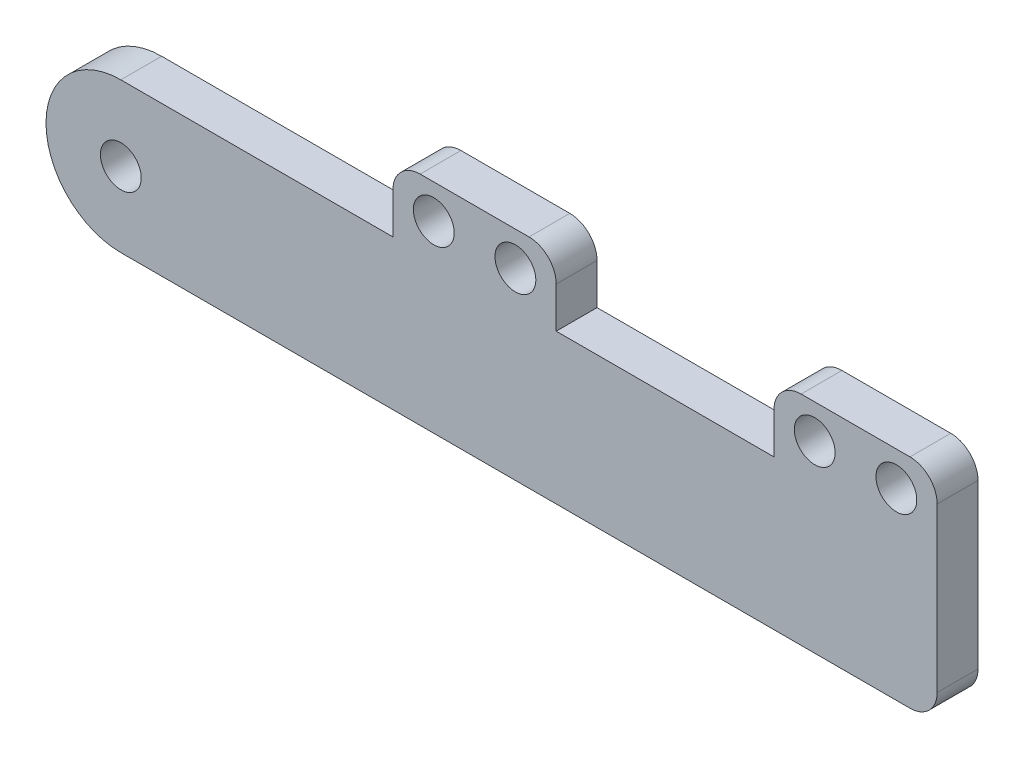
ISO-10303-21;
HEADER;
FILE_DESCRIPTION(('STEP AP214'),'2;1');
FILE_NAME('part.step','',(''),(''),'','','');
FILE_SCHEMA(('AUTOMOTIVE_DESIGN { 1 0 10303 214 1 1 1 1 }'));
ENDSEC;
DATA;
#1=APPLICATION_CONTEXT('core data for automotive mechanical design processes');
#2=APPLICATION_PROTOCOL_DEFINITION('international standard','automotive_design',2000,#1);
#3=PRODUCT_CONTEXT('',#1,'mechanical');
#4=PRODUCT('Part','Part','',(#3));
#5=PRODUCT_RELATED_PRODUCT_CATEGORY('part','',(#4));
#6=PRODUCT_DEFINITION_FORMATION('','',#4);
#7=PRODUCT_DEFINITION_CONTEXT('part definition',#1,'design');
#8=PRODUCT_DEFINITION('design','',#6,#7);
#9=PRODUCT_DEFINITION_SHAPE('','',#8);
#10=(LENGTH_UNIT() NAMED_UNIT(*) SI_UNIT(.MILLI.,.METRE.));
#11=(NAMED_UNIT(*) PLANE_ANGLE_UNIT() SI_UNIT($,.RADIAN.));
#12=(NAMED_UNIT(*) SI_UNIT($,.STERADIAN.) SOLID_ANGLE_UNIT());
#13=UNCERTAINTY_MEASURE_WITH_UNIT(LENGTH_MEASURE(1.E-05),#10,'distance_accuracy_value','');
#14=(GEOMETRIC_REPRESENTATION_CONTEXT(3) GLOBAL_UNCERTAINTY_ASSIGNED_CONTEXT((#13)) GLOBAL_UNIT_ASSIGNED_CONTEXT((#10,
#11,#12)) REPRESENTATION_CONTEXT('',''));
#15=CARTESIAN_POINT('',(0.,0.,0.));
#16=DIRECTION('',(0.,0.,1.));
#17=DIRECTION('',(1.,0.,0.));
#18=AXIS2_PLACEMENT_3D('',#15,#16,#17);
#19=CARTESIAN_POINT('',(-42.9563360227812,-5.5,3.));
#20=DIRECTION('',(0.,0.,-1.));
#21=DIRECTION('',(-1.,0.,0.));
#22=AXIS2_PLACEMENT_3D('',#19,#20,#21);
#23=PLANE('',#22);
#24=CARTESIAN_POINT('',(-42.9563360227812,-5.5,3.));
#25=DIRECTION('',(0.,0.,1.));
#26=DIRECTION('',(1.,0.,0.));
#27=AXIS2_PLACEMENT_3D('',#24,#25,#26);
#28=CIRCLE('',#27,1.5);
#29=CARTESIAN_POINT('',(-41.4563360227812,-5.5,3.));
#30=VERTEX_POINT('',#29);
#31=EDGE_CURVE('E304',#30,#30,#28,.T.);
#32=ORIENTED_EDGE('',*,*,#31,.F.);
#33=EDGE_LOOP('',(#32));
#34=FACE_BOUND('',#33,.T.);
#35=DIRECTION('',(1.,0.,0.));
#36=VECTOR('',#35,1.);
#37=CARTESIAN_POINT('',(17.0436639772188,-11.,3.));
#38=LINE('',#37,#36);
#39=CARTESIAN_POINT('',(-42.9563360227812,-11.,3.));
#40=VERTEX_POINT('',#39);
#41=CARTESIAN_POINT('',(15.0436639772188,-11.,3.));
#42=VERTEX_POINT('',#41);
#43=EDGE_CURVE('E152',#40,#42,#38,.T.);
#44=ORIENTED_EDGE('',*,*,#43,.T.);
#45=CARTESIAN_POINT('',(15.0436639772188,-9.,3.));
#46=DIRECTION('',(0.,0.,-1.));
#47=DIRECTION('',(-1.,0.,0.));
#48=AXIS2_PLACEMENT_3D('',#45,#46,#47);
#49=CIRCLE('',#48,2.);
#50=CARTESIAN_POINT('',(17.0436639772188,-8.99999999999999,3.));
#51=VERTEX_POINT('',#50);
#52=EDGE_CURVE('E195',#42,#51,#49,.F.);
#53=ORIENTED_EDGE('',*,*,#52,.T.);
#54=DIRECTION('',(0.,1.,0.));
#55=VECTOR('',#54,1.);
#56=CARTESIAN_POINT('',(17.0436639772188,5.,3.));
#57=LINE('',#56,#55);
#58=CARTESIAN_POINT('',(17.0436639772188,3.,3.));
#59=VERTEX_POINT('',#58);
#60=EDGE_CURVE('E276',#51,#59,#57,.T.);
#61=ORIENTED_EDGE('',*,*,#60,.T.);
#62=CARTESIAN_POINT('',(15.0436639772188,3.,3.));
#63=DIRECTION('',(0.,0.,-1.));
#64=DIRECTION('',(-1.,0.,0.));
#65=AXIS2_PLACEMENT_3D('',#62,#63,#64);
#66=CIRCLE('',#65,2.);
#67=CARTESIAN_POINT('',(15.0436639772188,5.,3.));
#68=VERTEX_POINT('',#67);
#69=EDGE_CURVE('E193',#59,#68,#66,.F.);
#70=ORIENTED_EDGE('',*,*,#69,.T.);
#71=DIRECTION('',(-1.,0.,0.));
#72=VECTOR('',#71,1.);
#73=CARTESIAN_POINT('',(5.04366397721881,5.,3.));
#74=LINE('',#73,#72);
#75=CARTESIAN_POINT('',(7.04366397721881,5.,3.));
#76=VERTEX_POINT('',#75);
#77=EDGE_CURVE('E273',#68,#76,#74,.T.);
#78=ORIENTED_EDGE('',*,*,#77,.T.);
#79=CARTESIAN_POINT('',(7.04366397721881,3.,3.));
#80=DIRECTION('',(0.,0.,-1.));
#81=DIRECTION('',(-1.,0.,0.));
#82=AXIS2_PLACEMENT_3D('',#79,#80,#81);
#83=CIRCLE('',#82,2.);
#84=CARTESIAN_POINT('',(5.04366397721881,3.,3.));
#85=VERTEX_POINT('',#84);
#86=EDGE_CURVE('E191',#76,#85,#83,.F.);
#87=ORIENTED_EDGE('',*,*,#86,.T.);
#88=DIRECTION('',(0.,-1.,0.));
#89=VECTOR('',#88,1.);
#90=CARTESIAN_POINT('',(5.04366397721881,0.,3.));
#91=LINE('',#90,#89);
#92=CARTESIAN_POINT('',(5.04366397721881,0.,3.));
#93=VERTEX_POINT('',#92);
#94=EDGE_CURVE('E271',#85,#93,#91,.T.);
#95=ORIENTED_EDGE('',*,*,#94,.T.);
#96=DIRECTION('',(-1.,0.,0.));
#97=VECTOR('',#96,1.);
#98=CARTESIAN_POINT('',(-10.9563360227812,0.,3.));
#99=LINE('',#98,#97);
#100=CARTESIAN_POINT('',(-10.9563360227812,0.,3.));
#101=VERTEX_POINT('',#100);
#102=EDGE_CURVE('E221',#93,#101,#99,.T.);
#103=ORIENTED_EDGE('',*,*,#102,.T.);
#104=DIRECTION('',(0.,1.,0.));
#105=VECTOR('',#104,1.);
#106=CARTESIAN_POINT('',(-10.9563360227812,5.,3.));
#107=LINE('',#106,#105);
#108=CARTESIAN_POINT('',(-10.9563360227812,3.,3.));
#109=VERTEX_POINT('',#108);
#110=EDGE_CURVE('E215',#101,#109,#107,.T.);
#111=ORIENTED_EDGE('',*,*,#110,.T.);
#112=CARTESIAN_POINT('',(-12.9563360227812,3.,3.));
#113=DIRECTION('',(0.,0.,-1.));
#114=DIRECTION('',(-1.,0.,0.));
#115=AXIS2_PLACEMENT_3D('',#112,#113,#114);
#116=CIRCLE('',#115,2.);
#117=CARTESIAN_POINT('',(-12.9563360227812,5.,3.));
#118=VERTEX_POINT('',#117);
#119=EDGE_CURVE('E189',#109,#118,#116,.F.);
#120=ORIENTED_EDGE('',*,*,#119,.T.);
#121=DIRECTION('',(-1.,0.,0.));
#122=VECTOR('',#121,1.);
#123=CARTESIAN_POINT('',(-22.9563360227812,5.,3.));
#124=LINE('',#123,#122);
#125=CARTESIAN_POINT('',(-20.9563360227812,5.,3.));
#126=VERTEX_POINT('',#125);
#127=EDGE_CURVE('E223',#118,#126,#124,.T.);
#128=ORIENTED_EDGE('',*,*,#127,.T.);
#129=CARTESIAN_POINT('',(-20.9563360227812,3.,3.));
#130=DIRECTION('',(0.,0.,-1.));
#131=DIRECTION('',(-1.,0.,0.));
#132=AXIS2_PLACEMENT_3D('',#129,#130,#131);
#133=CIRCLE('',#132,2.);
#134=CARTESIAN_POINT('',(-22.9563360227812,3.,3.));
#135=VERTEX_POINT('',#134);
#136=EDGE_CURVE('E48',#126,#135,#133,.F.);
#137=ORIENTED_EDGE('',*,*,#136,.T.);
#138=DIRECTION('',(0.,-1.,0.));
#139=VECTOR('',#138,1.);
#140=CARTESIAN_POINT('',(-22.9563360227812,0.,3.));
#141=LINE('',#140,#139);
#142=CARTESIAN_POINT('',(-22.9563360227812,0.,3.));
#143=VERTEX_POINT('',#142);
#144=EDGE_CURVE('E157',#135,#143,#141,.T.);
#145=ORIENTED_EDGE('',*,*,#144,.T.);
#146=DIRECTION('',(-1.,0.,0.));
#147=VECTOR('',#146,1.);
#148=CARTESIAN_POINT('',(-22.9563360227812,0.,3.));
#149=LINE('',#148,#147);
#150=CARTESIAN_POINT('',(-42.9563360227812,0.,3.));
#151=VERTEX_POINT('',#150);
#152=EDGE_CURVE('E153',#143,#151,#149,.T.);
#153=ORIENTED_EDGE('',*,*,#152,.T.);
#154=CARTESIAN_POINT('',(-42.9563360227812,-5.5,3.));
#155=DIRECTION('',(0.,0.,1.));
#156=DIRECTION('',(-1.,0.,0.));
#157=AXIS2_PLACEMENT_3D('',#154,#155,#156);
#158=CIRCLE('',#157,5.5);
#159=EDGE_CURVE('E142',#151,#40,#158,.T.);
#160=ORIENTED_EDGE('',*,*,#159,.T.);
#161=EDGE_LOOP('',(#44,#53,#61,#70,#78,#87,#95,#103,#111,#120,#128,#137,#145,#153,#160));
#162=FACE_BOUND('',#161,.T.);
#163=CARTESIAN_POINT('',(-19.9563360227812,2.5,3.));
#164=DIRECTION('',(0.,0.,1.));
#165=DIRECTION('',(1.,0.,0.));
#166=AXIS2_PLACEMENT_3D('',#163,#164,#165);
#167=CIRCLE('',#166,1.5);
#168=CARTESIAN_POINT('',(-18.4563360227812,2.5,3.));
#169=VERTEX_POINT('',#168);
#170=EDGE_CURVE('E267',#169,#169,#167,.T.);
#171=ORIENTED_EDGE('',*,*,#170,.F.);
#172=EDGE_LOOP('',(#171));
#173=FACE_BOUND('',#172,.T.);
#174=CARTESIAN_POINT('',(-13.9563360227812,2.5,3.));
#175=DIRECTION('',(0.,0.,1.));
#176=DIRECTION('',(-1.,0.,0.));
#177=AXIS2_PLACEMENT_3D('',#174,#175,#176);
#178=CIRCLE('',#177,1.5);
#179=CARTESIAN_POINT('',(-15.4563360227812,2.5,3.));
#180=VERTEX_POINT('',#179);
#181=EDGE_CURVE('E283',#180,#180,#178,.T.);
#182=ORIENTED_EDGE('',*,*,#181,.F.);
#183=EDGE_LOOP('',(#182));
#184=FACE_BOUND('',#183,.T.);
#185=CARTESIAN_POINT('',(8.04366397721881,2.5,3.));
#186=DIRECTION('',(0.,0.,1.));
#187=DIRECTION('',(1.,0.,0.));
#188=AXIS2_PLACEMENT_3D('',#185,#186,#187);
#189=CIRCLE('',#188,1.5);
#190=CARTESIAN_POINT('',(9.54366397721881,2.5,3.));
#191=VERTEX_POINT('',#190);
#192=EDGE_CURVE('E289',#191,#191,#189,.T.);
#193=ORIENTED_EDGE('',*,*,#192,.F.);
#194=EDGE_LOOP('',(#193));
#195=FACE_BOUND('',#194,.T.);
#196=CARTESIAN_POINT('',(14.0436639772188,2.5,3.));
#197=DIRECTION('',(0.,0.,1.));
#198=DIRECTION('',(-1.,0.,0.));
#199=AXIS2_PLACEMENT_3D('',#196,#197,#198);
#200=CIRCLE('',#199,1.5);
#201=CARTESIAN_POINT('',(12.5436639772188,2.5,3.));
#202=VERTEX_POINT('',#201);
#203=EDGE_CURVE('E295',#202,#202,#200,.T.);
#204=ORIENTED_EDGE('',*,*,#203,.F.);
#205=EDGE_LOOP('',(#204));
#206=FACE_BOUND('',#205,.T.);
#207=ADVANCED_FACE('F33',(#34,#162,#173,#184,#195,#206),#23,.F.);
#208=CARTESIAN_POINT('',(-42.9563360227812,-5.5,0.));
#209=DIRECTION('',(0.,0.,-1.));
#210=DIRECTION('',(-1.,0.,0.));
#211=AXIS2_PLACEMENT_3D('',#208,#209,#210);
#212=PLANE('',#211);
#213=CARTESIAN_POINT('',(-42.9563360227812,-5.5,0.));
#214=DIRECTION('',(0.,0.,1.));
#215=DIRECTION('',(1.,0.,0.));
#216=AXIS2_PLACEMENT_3D('',#213,#214,#215);
#217=CIRCLE('',#216,1.5);
#218=CARTESIAN_POINT('',(-41.4563360227812,-5.5,0.));
#219=VERTEX_POINT('',#218);
#220=EDGE_CURVE('E301',#219,#219,#217,.T.);
#221=ORIENTED_EDGE('',*,*,#220,.T.);
#222=EDGE_LOOP('',(#221));
#223=FACE_BOUND('',#222,.T.);
#224=CARTESIAN_POINT('',(8.04366397721881,2.5,0.));
#225=DIRECTION('',(0.,0.,1.));
#226=DIRECTION('',(1.,0.,0.));
#227=AXIS2_PLACEMENT_3D('',#224,#225,#226);
#228=CIRCLE('',#227,1.5);
#229=CARTESIAN_POINT('',(9.54366397721881,2.5,0.));
#230=VERTEX_POINT('',#229);
#231=EDGE_CURVE('E292',#230,#230,#228,.T.);
#232=ORIENTED_EDGE('',*,*,#231,.T.);
#233=EDGE_LOOP('',(#232));
#234=FACE_BOUND('',#233,.T.);
#235=CARTESIAN_POINT('',(-19.9563360227812,2.5,0.));
#236=DIRECTION('',(0.,0.,1.));
#237=DIRECTION('',(1.,0.,0.));
#238=AXIS2_PLACEMENT_3D('',#235,#236,#237);
#239=CIRCLE('',#238,1.5);
#240=CARTESIAN_POINT('',(-18.4563360227812,2.5,0.));
#241=VERTEX_POINT('',#240);
#242=EDGE_CURVE('E280',#241,#241,#239,.T.);
#243=ORIENTED_EDGE('',*,*,#242,.T.);
#244=EDGE_LOOP('',(#243));
#245=FACE_BOUND('',#244,.T.);
#246=DIRECTION('',(0.,1.,0.));
#247=VECTOR('',#246,1.);
#248=CARTESIAN_POINT('',(17.0436639772188,5.,0.));
#249=LINE('',#248,#247);
#250=CARTESIAN_POINT('',(17.0436639772188,-8.99999999999999,0.));
#251=VERTEX_POINT('',#250);
#252=CARTESIAN_POINT('',(17.0436639772188,3.,0.));
#253=VERTEX_POINT('',#252);
#254=EDGE_CURVE('E258',#251,#253,#249,.T.);
#255=ORIENTED_EDGE('',*,*,#254,.F.);
#256=CARTESIAN_POINT('',(15.0436639772188,-9.,0.));
#257=DIRECTION('',(0.,0.,-1.));
#258=DIRECTION('',(-1.,0.,0.));
#259=AXIS2_PLACEMENT_3D('',#256,#257,#258);
#260=CIRCLE('',#259,2.);
#261=CARTESIAN_POINT('',(15.0436639772188,-11.,0.));
#262=VERTEX_POINT('',#261);
#263=EDGE_CURVE('E184',#251,#262,#260,.T.);
#264=ORIENTED_EDGE('',*,*,#263,.T.);
#265=DIRECTION('',(1.,0.,0.));
#266=VECTOR('',#265,1.);
#267=CARTESIAN_POINT('',(17.0436639772188,-11.,0.));
#268=LINE('',#267,#266);
#269=CARTESIAN_POINT('',(-42.9563360227812,-11.,0.));
#270=VERTEX_POINT('',#269);
#271=EDGE_CURVE('E261',#270,#262,#268,.T.);
#272=ORIENTED_EDGE('',*,*,#271,.F.);
#273=CARTESIAN_POINT('',(-42.9563360227812,-5.5,0.));
#274=DIRECTION('',(0.,0.,1.));
#275=DIRECTION('',(-1.,0.,0.));
#276=AXIS2_PLACEMENT_3D('',#273,#274,#275);
#277=CIRCLE('',#276,5.5);
#278=CARTESIAN_POINT('',(-42.9563360227812,0.,0.));
#279=VERTEX_POINT('',#278);
#280=EDGE_CURVE('E264',#279,#270,#277,.T.);
#281=ORIENTED_EDGE('',*,*,#280,.F.);
#282=DIRECTION('',(-1.,0.,0.));
#283=VECTOR('',#282,1.);
#284=CARTESIAN_POINT('',(-22.9563360227812,0.,0.));
#285=LINE('',#284,#283);
#286=CARTESIAN_POINT('',(-22.9563360227812,0.,0.));
#287=VERTEX_POINT('',#286);
#288=EDGE_CURVE('E165',#287,#279,#285,.T.);
#289=ORIENTED_EDGE('',*,*,#288,.F.);
#290=DIRECTION('',(0.,-1.,0.));
#291=VECTOR('',#290,1.);
#292=CARTESIAN_POINT('',(-22.9563360227812,0.,0.));
#293=LINE('',#292,#291);
#294=CARTESIAN_POINT('',(-22.9563360227812,3.,0.));
#295=VERTEX_POINT('',#294);
#296=EDGE_CURVE('E161',#295,#287,#293,.T.);
#297=ORIENTED_EDGE('',*,*,#296,.F.);
#298=CARTESIAN_POINT('',(-20.9563360227812,3.,0.));
#299=DIRECTION('',(0.,0.,-1.));
#300=DIRECTION('',(-1.,0.,0.));
#301=AXIS2_PLACEMENT_3D('',#298,#299,#300);
#302=CIRCLE('',#301,2.);
#303=CARTESIAN_POINT('',(-20.9563360227812,5.,0.));
#304=VERTEX_POINT('',#303);
#305=EDGE_CURVE('E176',#295,#304,#302,.T.);
#306=ORIENTED_EDGE('',*,*,#305,.T.);
#307=DIRECTION('',(-1.,0.,0.));
#308=VECTOR('',#307,1.);
#309=CARTESIAN_POINT('',(-22.9563360227812,5.,0.));
#310=LINE('',#309,#308);
#311=CARTESIAN_POINT('',(-12.9563360227812,5.,0.));
#312=VERTEX_POINT('',#311);
#313=EDGE_CURVE('E229',#312,#304,#310,.T.);
#314=ORIENTED_EDGE('',*,*,#313,.F.);
#315=CARTESIAN_POINT('',(-12.9563360227812,3.,0.));
#316=DIRECTION('',(0.,0.,-1.));
#317=DIRECTION('',(-1.,0.,0.));
#318=AXIS2_PLACEMENT_3D('',#315,#316,#317);
#319=CIRCLE('',#318,2.);
#320=CARTESIAN_POINT('',(-10.9563360227812,3.,0.));
#321=VERTEX_POINT('',#320);
#322=EDGE_CURVE('E178',#312,#321,#319,.T.);
#323=ORIENTED_EDGE('',*,*,#322,.T.);
#324=DIRECTION('',(0.,1.,0.));
#325=VECTOR('',#324,1.);
#326=CARTESIAN_POINT('',(-10.9563360227812,5.,0.));
#327=LINE('',#326,#325);
#328=CARTESIAN_POINT('',(-10.9563360227812,0.,0.));
#329=VERTEX_POINT('',#328);
#330=EDGE_CURVE('E217',#329,#321,#327,.T.);
#331=ORIENTED_EDGE('',*,*,#330,.F.);
#332=DIRECTION('',(-1.,0.,0.));
#333=VECTOR('',#332,1.);
#334=CARTESIAN_POINT('',(-10.9563360227812,0.,0.));
#335=LINE('',#334,#333);
#336=CARTESIAN_POINT('',(5.04366397721881,0.,0.));
#337=VERTEX_POINT('',#336);
#338=EDGE_CURVE('E237',#337,#329,#335,.T.);
#339=ORIENTED_EDGE('',*,*,#338,.F.);
#340=DIRECTION('',(0.,-1.,0.));
#341=VECTOR('',#340,1.);
#342=CARTESIAN_POINT('',(5.04366397721881,0.,0.));
#343=LINE('',#342,#341);
#344=CARTESIAN_POINT('',(5.04366397721881,3.,0.));
#345=VERTEX_POINT('',#344);
#346=EDGE_CURVE('E252',#345,#337,#343,.T.);
#347=ORIENTED_EDGE('',*,*,#346,.F.);
#348=CARTESIAN_POINT('',(7.04366397721881,3.,0.));
#349=DIRECTION('',(0.,0.,-1.));
#350=DIRECTION('',(-1.,0.,0.));
#351=AXIS2_PLACEMENT_3D('',#348,#349,#350);
#352=CIRCLE('',#351,2.);
#353=CARTESIAN_POINT('',(7.04366397721881,5.,0.));
#354=VERTEX_POINT('',#353);
#355=EDGE_CURVE('E180',#345,#354,#352,.T.);
#356=ORIENTED_EDGE('',*,*,#355,.T.);
#357=DIRECTION('',(-1.,0.,0.));
#358=VECTOR('',#357,1.);
#359=CARTESIAN_POINT('',(5.04366397721881,5.,0.));
#360=LINE('',#359,#358);
#361=CARTESIAN_POINT('',(15.0436639772188,5.,0.));
#362=VERTEX_POINT('',#361);
#363=EDGE_CURVE('E253',#362,#354,#360,.T.);
#364=ORIENTED_EDGE('',*,*,#363,.F.);
#365=CARTESIAN_POINT('',(15.0436639772188,3.,0.));
#366=DIRECTION('',(0.,0.,-1.));
#367=DIRECTION('',(-1.,0.,0.));
#368=AXIS2_PLACEMENT_3D('',#365,#366,#367);
#369=CIRCLE('',#368,2.);
#370=EDGE_CURVE('E182',#362,#253,#369,.T.);
#371=ORIENTED_EDGE('',*,*,#370,.T.);
#372=EDGE_LOOP('',(#255,#264,#272,#281,#289,#297,#306,#314,#323,#331,#339,#347,#356,#364,#371));
#373=FACE_BOUND('',#372,.T.);
#374=CARTESIAN_POINT('',(-13.9563360227812,2.5,0.));
#375=DIRECTION('',(0.,0.,1.));
#376=DIRECTION('',(-1.,0.,0.));
#377=AXIS2_PLACEMENT_3D('',#374,#375,#376);
#378=CIRCLE('',#377,1.5);
#379=CARTESIAN_POINT('',(-15.4563360227812,2.5,0.));
#380=VERTEX_POINT('',#379);
#381=EDGE_CURVE('E286',#380,#380,#378,.T.);
#382=ORIENTED_EDGE('',*,*,#381,.T.);
#383=EDGE_LOOP('',(#382));
#384=FACE_BOUND('',#383,.T.);
#385=CARTESIAN_POINT('',(14.0436639772188,2.5,0.));
#386=DIRECTION('',(0.,0.,1.));
#387=DIRECTION('',(-1.,0.,0.));
#388=AXIS2_PLACEMENT_3D('',#385,#386,#387);
#389=CIRCLE('',#388,1.5);
#390=CARTESIAN_POINT('',(12.5436639772188,2.5,0.));
#391=VERTEX_POINT('',#390);
#392=EDGE_CURVE('E298',#391,#391,#389,.T.);
#393=ORIENTED_EDGE('',*,*,#392,.T.);
#394=EDGE_LOOP('',(#393));
#395=FACE_BOUND('',#394,.T.);
#396=ADVANCED_FACE('F232',(#223,#234,#245,#373,#384,#395),#212,.T.);
#397=CARTESIAN_POINT('',(-22.9563360227812,0.,3.));
#398=DIRECTION('',(0.,-1.,0.));
#399=DIRECTION('',(1.,0.,0.));
#400=AXIS2_PLACEMENT_3D('',#397,#398,#399);
#401=PLANE('',#400);
#402=ORIENTED_EDGE('',*,*,#288,.T.);
#403=DIRECTION('',(0.,0.,-1.));
#404=VECTOR('',#403,1.);
#405=CARTESIAN_POINT('',(-42.9563360227812,0.,3.));
#406=LINE('',#405,#404);
#407=EDGE_CURVE('E146',#151,#279,#406,.T.);
#408=ORIENTED_EDGE('',*,*,#407,.F.);
#409=ORIENTED_EDGE('',*,*,#152,.F.);
#410=DIRECTION('',(0.,0.,-1.));
#411=VECTOR('',#410,1.);
#412=CARTESIAN_POINT('',(-22.9563360227812,0.,3.));
#413=LINE('',#412,#411);
#414=EDGE_CURVE('E241',#143,#287,#413,.T.);
#415=ORIENTED_EDGE('',*,*,#414,.T.);
#416=EDGE_LOOP('',(#402,#408,#409,#415));
#417=FACE_BOUND('',#416,.T.);
#418=ADVANCED_FACE('F163',(#417),#401,.F.);
#419=CARTESIAN_POINT('',(-42.9563360227812,-5.5,3.));
#420=DIRECTION('',(0.,0.,-1.));
#421=DIRECTION('',(-1.,0.,0.));
#422=AXIS2_PLACEMENT_3D('',#419,#420,#421);
#423=CYLINDRICAL_SURFACE('',#422,5.5);
#424=ORIENTED_EDGE('',*,*,#280,.T.);
#425=DIRECTION('',(0.,0.,-1.));
#426=VECTOR('',#425,1.);
#427=CARTESIAN_POINT('',(-42.9563360227812,-11.,3.));
#428=LINE('',#427,#426);
#429=EDGE_CURVE('E149',#40,#270,#428,.T.);
#430=ORIENTED_EDGE('',*,*,#429,.F.);
#431=ORIENTED_EDGE('',*,*,#159,.F.);
#432=ORIENTED_EDGE('',*,*,#407,.T.);
#433=EDGE_LOOP('',(#424,#430,#431,#432));
#434=FACE_BOUND('',#433,.T.);
#435=ADVANCED_FACE('F144',(#434),#423,.T.);
#436=CARTESIAN_POINT('',(17.0436639772188,-11.,3.));
#437=DIRECTION('',(0.,1.,0.));
#438=DIRECTION('',(-1.,0.,0.));
#439=AXIS2_PLACEMENT_3D('',#436,#437,#438);
#440=PLANE('',#439);
#441=ORIENTED_EDGE('',*,*,#271,.T.);
#442=DIRECTION('',(0.,0.,-1.));
#443=VECTOR('',#442,1.);
#444=CARTESIAN_POINT('',(15.0436639772188,-11.,3.));
#445=LINE('',#444,#443);
#446=EDGE_CURVE('E186',#262,#42,#445,.F.);
#447=ORIENTED_EDGE('',*,*,#446,.T.);
#448=ORIENTED_EDGE('',*,*,#43,.F.);
#449=ORIENTED_EDGE('',*,*,#429,.T.);
#450=EDGE_LOOP('',(#441,#447,#448,#449));
#451=FACE_BOUND('',#450,.T.);
#452=ADVANCED_FACE('F350',(#451),#440,.F.);
#453=CARTESIAN_POINT('',(17.0436639772188,5.,3.));
#454=DIRECTION('',(-1.,0.,0.));
#455=DIRECTION('',(0.,-1.,0.));
#456=AXIS2_PLACEMENT_3D('',#453,#454,#455);
#457=PLANE('',#456);
#458=ORIENTED_EDGE('',*,*,#60,.F.);
#459=DIRECTION('',(0.,0.,-1.));
#460=VECTOR('',#459,1.);
#461=CARTESIAN_POINT('',(17.0436639772188,-8.99999999999999,3.));
#462=LINE('',#461,#460);
#463=EDGE_CURVE('E168',#51,#251,#462,.T.);
#464=ORIENTED_EDGE('',*,*,#463,.T.);
#465=ORIENTED_EDGE('',*,*,#254,.T.);
#466=DIRECTION('',(0.,0.,-1.));
#467=VECTOR('',#466,1.);
#468=CARTESIAN_POINT('',(17.0436639772188,3.,3.));
#469=LINE('',#468,#467);
#470=EDGE_CURVE('E166',#253,#59,#469,.F.);
#471=ORIENTED_EDGE('',*,*,#470,.T.);
#472=EDGE_LOOP('',(#458,#464,#465,#471));
#473=FACE_BOUND('',#472,.T.);
#474=ADVANCED_FACE('F346',(#473),#457,.F.);
#475=CARTESIAN_POINT('',(5.04366397721881,5.,3.));
#476=DIRECTION('',(0.,-1.,0.));
#477=DIRECTION('',(0.,0.,-1.));
#478=AXIS2_PLACEMENT_3D('',#475,#476,#477);
#479=PLANE('',#478);
#480=ORIENTED_EDGE('',*,*,#77,.F.);
#481=DIRECTION('',(0.,0.,-1.));
#482=VECTOR('',#481,1.);
#483=CARTESIAN_POINT('',(15.0436639772188,5.,3.));
#484=LINE('',#483,#482);
#485=EDGE_CURVE('E199',#68,#362,#484,.T.);
#486=ORIENTED_EDGE('',*,*,#485,.T.);
#487=ORIENTED_EDGE('',*,*,#363,.T.);
#488=DIRECTION('',(0.,0.,-1.));
#489=VECTOR('',#488,1.);
#490=CARTESIAN_POINT('',(7.04366397721881,5.,3.));
#491=LINE('',#490,#489);
#492=EDGE_CURVE('E197',#354,#76,#491,.F.);
#493=ORIENTED_EDGE('',*,*,#492,.T.);
#494=EDGE_LOOP('',(#480,#486,#487,#493));
#495=FACE_BOUND('',#494,.T.);
#496=ADVANCED_FACE('F343',(#495),#479,.F.);
#497=CARTESIAN_POINT('',(5.04366397721881,0.,3.));
#498=DIRECTION('',(1.,0.,0.));
#499=DIRECTION('',(0.,0.,-1.));
#500=AXIS2_PLACEMENT_3D('',#497,#498,#499);
#501=PLANE('',#500);
#502=ORIENTED_EDGE('',*,*,#94,.F.);
#503=DIRECTION('',(0.,0.,-1.));
#504=VECTOR('',#503,1.);
#505=CARTESIAN_POINT('',(5.04366397721881,3.,3.));
#506=LINE('',#505,#504);
#507=EDGE_CURVE('E202',#85,#345,#506,.T.);
#508=ORIENTED_EDGE('',*,*,#507,.T.);
#509=ORIENTED_EDGE('',*,*,#346,.T.);
#510=DIRECTION('',(0.,0.,-1.));
#511=VECTOR('',#510,1.);
#512=CARTESIAN_POINT('',(5.04366397721881,0.,3.));
#513=LINE('',#512,#511);
#514=EDGE_CURVE('E170',#93,#337,#513,.T.);
#515=ORIENTED_EDGE('',*,*,#514,.F.);
#516=EDGE_LOOP('',(#502,#508,#509,#515));
#517=FACE_BOUND('',#516,.T.);
#518=ADVANCED_FACE('F340',(#517),#501,.F.);
#519=CARTESIAN_POINT('',(-10.9563360227812,0.,3.));
#520=DIRECTION('',(0.,-1.,0.));
#521=DIRECTION('',(0.,0.,-1.));
#522=AXIS2_PLACEMENT_3D('',#519,#520,#521);
#523=PLANE('',#522);
#524=ORIENTED_EDGE('',*,*,#338,.T.);
#525=DIRECTION('',(0.,0.,-1.));
#526=VECTOR('',#525,1.);
#527=CARTESIAN_POINT('',(-10.9563360227812,0.,3.));
#528=LINE('',#527,#526);
#529=EDGE_CURVE('E243',#101,#329,#528,.T.);
#530=ORIENTED_EDGE('',*,*,#529,.F.);
#531=ORIENTED_EDGE('',*,*,#102,.F.);
#532=ORIENTED_EDGE('',*,*,#514,.T.);
#533=EDGE_LOOP('',(#524,#530,#531,#532));
#534=FACE_BOUND('',#533,.T.);
#535=ADVANCED_FACE('F248',(#534),#523,.F.);
#536=CARTESIAN_POINT('',(-10.9563360227812,5.,3.));
#537=DIRECTION('',(-1.,0.,0.));
#538=DIRECTION('',(0.,0.,1.));
#539=AXIS2_PLACEMENT_3D('',#536,#537,#538);
#540=PLANE('',#539);
#541=ORIENTED_EDGE('',*,*,#330,.T.);
#542=DIRECTION('',(0.,0.,-1.));
#543=VECTOR('',#542,1.);
#544=CARTESIAN_POINT('',(-10.9563360227812,3.,3.));
#545=LINE('',#544,#543);
#546=EDGE_CURVE('E41',#321,#109,#545,.F.);
#547=ORIENTED_EDGE('',*,*,#546,.T.);
#548=ORIENTED_EDGE('',*,*,#110,.F.);
#549=ORIENTED_EDGE('',*,*,#529,.T.);
#550=EDGE_LOOP('',(#541,#547,#548,#549));
#551=FACE_BOUND('',#550,.T.);
#552=ADVANCED_FACE('F213',(#551),#540,.F.);
#553=CARTESIAN_POINT('',(-22.9563360227812,5.,3.));
#554=DIRECTION('',(0.,-1.,0.));
#555=DIRECTION('',(1.,0.,0.));
#556=AXIS2_PLACEMENT_3D('',#553,#554,#555);
#557=PLANE('',#556);
#558=ORIENTED_EDGE('',*,*,#127,.F.);
#559=DIRECTION('',(0.,0.,-1.));
#560=VECTOR('',#559,1.);
#561=CARTESIAN_POINT('',(-12.9563360227812,5.,3.));
#562=LINE('',#561,#560);
#563=EDGE_CURVE('E206',#118,#312,#562,.T.);
#564=ORIENTED_EDGE('',*,*,#563,.T.);
#565=ORIENTED_EDGE('',*,*,#313,.T.);
#566=DIRECTION('',(0.,0.,-1.));
#567=VECTOR('',#566,1.);
#568=CARTESIAN_POINT('',(-20.9563360227812,5.,3.));
#569=LINE('',#568,#567);
#570=EDGE_CURVE('E56',#304,#126,#569,.F.);
#571=ORIENTED_EDGE('',*,*,#570,.T.);
#572=EDGE_LOOP('',(#558,#564,#565,#571));
#573=FACE_BOUND('',#572,.T.);
#574=ADVANCED_FACE('F228',(#573),#557,.F.);
#575=CARTESIAN_POINT('',(-22.9563360227812,0.,3.));
#576=DIRECTION('',(1.,0.,0.));
#577=DIRECTION('',(0.,1.,0.));
#578=AXIS2_PLACEMENT_3D('',#575,#576,#577);
#579=PLANE('',#578);
#580=ORIENTED_EDGE('',*,*,#144,.F.);
#581=DIRECTION('',(0.,0.,-1.));
#582=VECTOR('',#581,1.);
#583=CARTESIAN_POINT('',(-22.9563360227812,3.,3.));
#584=LINE('',#583,#582);
#585=EDGE_CURVE('E11',#135,#295,#584,.T.);
#586=ORIENTED_EDGE('',*,*,#585,.T.);
#587=ORIENTED_EDGE('',*,*,#296,.T.);
#588=ORIENTED_EDGE('',*,*,#414,.F.);
#589=EDGE_LOOP('',(#580,#586,#587,#588));
#590=FACE_BOUND('',#589,.T.);
#591=ADVANCED_FACE('F330',(#590),#579,.F.);
#592=CARTESIAN_POINT('',(-19.9563360227812,2.5,3.));
#593=DIRECTION('',(0.,0.,-1.));
#594=DIRECTION('',(-1.,0.,0.));
#595=AXIS2_PLACEMENT_3D('',#592,#593,#594);
#596=CYLINDRICAL_SURFACE('',#595,1.5);
#597=ORIENTED_EDGE('',*,*,#170,.T.);
#598=EDGE_LOOP('',(#597));
#599=FACE_BOUND('',#598,.T.);
#600=ORIENTED_EDGE('',*,*,#242,.F.);
#601=EDGE_LOOP('',(#600));
#602=FACE_BOUND('',#601,.T.);
#603=ADVANCED_FACE('F327',(#599,#602),#596,.F.);
#604=CARTESIAN_POINT('',(-13.9563360227812,2.5,3.));
#605=DIRECTION('',(0.,0.,-1.));
#606=DIRECTION('',(-1.,0.,0.));
#607=AXIS2_PLACEMENT_3D('',#604,#605,#606);
#608=CYLINDRICAL_SURFACE('',#607,1.5);
#609=ORIENTED_EDGE('',*,*,#181,.T.);
#610=EDGE_LOOP('',(#609));
#611=FACE_BOUND('',#610,.T.);
#612=ORIENTED_EDGE('',*,*,#381,.F.);
#613=EDGE_LOOP('',(#612));
#614=FACE_BOUND('',#613,.T.);
#615=ADVANCED_FACE('F494',(#611,#614),#608,.F.);
#616=CARTESIAN_POINT('',(8.04366397721881,2.5,3.));
#617=DIRECTION('',(0.,0.,-1.));
#618=DIRECTION('',(-1.,0.,0.));
#619=AXIS2_PLACEMENT_3D('',#616,#617,#618);
#620=CYLINDRICAL_SURFACE('',#619,1.5);
#621=ORIENTED_EDGE('',*,*,#192,.T.);
#622=EDGE_LOOP('',(#621));
#623=FACE_BOUND('',#622,.T.);
#624=ORIENTED_EDGE('',*,*,#231,.F.);
#625=EDGE_LOOP('',(#624));
#626=FACE_BOUND('',#625,.T.);
#627=ADVANCED_FACE('F484',(#623,#626),#620,.F.);
#628=CARTESIAN_POINT('',(14.0436639772188,2.5,3.));
#629=DIRECTION('',(0.,0.,-1.));
#630=DIRECTION('',(-1.,0.,0.));
#631=AXIS2_PLACEMENT_3D('',#628,#629,#630);
#632=CYLINDRICAL_SURFACE('',#631,1.5);
#633=ORIENTED_EDGE('',*,*,#203,.T.);
#634=EDGE_LOOP('',(#633));
#635=FACE_BOUND('',#634,.T.);
#636=ORIENTED_EDGE('',*,*,#392,.F.);
#637=EDGE_LOOP('',(#636));
#638=FACE_BOUND('',#637,.T.);
#639=ADVANCED_FACE('F316',(#635,#638),#632,.F.);
#640=CARTESIAN_POINT('',(-42.9563360227812,-5.5,0.));
#641=DIRECTION('',(0.,0.,1.));
#642=DIRECTION('',(1.,0.,0.));
#643=AXIS2_PLACEMENT_3D('',#640,#641,#642);
#644=CYLINDRICAL_SURFACE('',#643,1.5);
#645=ORIENTED_EDGE('',*,*,#220,.F.);
#646=EDGE_LOOP('',(#645));
#647=FACE_BOUND('',#646,.T.);
#648=ORIENTED_EDGE('',*,*,#31,.T.);
#649=EDGE_LOOP('',(#648));
#650=FACE_BOUND('',#649,.T.);
#651=ADVANCED_FACE('F312',(#647,#650),#644,.F.);
#652=CARTESIAN_POINT('',(15.0436639772188,-9.,3.));
#653=DIRECTION('',(0.,0.,-1.));
#654=DIRECTION('',(-1.,0.,0.));
#655=AXIS2_PLACEMENT_3D('',#652,#653,#654);
#656=CYLINDRICAL_SURFACE('',#655,2.);
#657=ORIENTED_EDGE('',*,*,#52,.F.);
#658=ORIENTED_EDGE('',*,*,#446,.F.);
#659=ORIENTED_EDGE('',*,*,#263,.F.);
#660=ORIENTED_EDGE('',*,*,#463,.F.);
#661=EDGE_LOOP('',(#657,#658,#659,#660));
#662=FACE_BOUND('',#661,.T.);
#663=ADVANCED_FACE('F315',(#662),#656,.T.);
#664=CARTESIAN_POINT('',(15.0436639772188,3.,3.));
#665=DIRECTION('',(0.,0.,-1.));
#666=DIRECTION('',(-1.,0.,0.));
#667=AXIS2_PLACEMENT_3D('',#664,#665,#666);
#668=CYLINDRICAL_SURFACE('',#667,2.);
#669=ORIENTED_EDGE('',*,*,#69,.F.);
#670=ORIENTED_EDGE('',*,*,#470,.F.);
#671=ORIENTED_EDGE('',*,*,#370,.F.);
#672=ORIENTED_EDGE('',*,*,#485,.F.);
#673=EDGE_LOOP('',(#669,#670,#671,#672));
#674=FACE_BOUND('',#673,.T.);
#675=ADVANCED_FACE('F361',(#674),#668,.T.);
#676=CARTESIAN_POINT('',(7.04366397721881,3.,3.));
#677=DIRECTION('',(0.,0.,-1.));
#678=DIRECTION('',(-1.,0.,0.));
#679=AXIS2_PLACEMENT_3D('',#676,#677,#678);
#680=CYLINDRICAL_SURFACE('',#679,2.);
#681=ORIENTED_EDGE('',*,*,#86,.F.);
#682=ORIENTED_EDGE('',*,*,#492,.F.);
#683=ORIENTED_EDGE('',*,*,#355,.F.);
#684=ORIENTED_EDGE('',*,*,#507,.F.);
#685=EDGE_LOOP('',(#681,#682,#683,#684));
#686=FACE_BOUND('',#685,.T.);
#687=ADVANCED_FACE('F365',(#686),#680,.T.);
#688=CARTESIAN_POINT('',(-12.9563360227812,3.,3.));
#689=DIRECTION('',(0.,0.,-1.));
#690=DIRECTION('',(-1.,0.,0.));
#691=AXIS2_PLACEMENT_3D('',#688,#689,#690);
#692=CYLINDRICAL_SURFACE('',#691,2.);
#693=ORIENTED_EDGE('',*,*,#119,.F.);
#694=ORIENTED_EDGE('',*,*,#546,.F.);
#695=ORIENTED_EDGE('',*,*,#322,.F.);
#696=ORIENTED_EDGE('',*,*,#563,.F.);
#697=EDGE_LOOP('',(#693,#694,#695,#696));
#698=FACE_BOUND('',#697,.T.);
#699=ADVANCED_FACE('F226',(#698),#692,.T.);
#700=CARTESIAN_POINT('',(-20.9563360227812,3.,3.));
#701=DIRECTION('',(0.,0.,-1.));
#702=DIRECTION('',(-1.,0.,0.));
#703=AXIS2_PLACEMENT_3D('',#700,#701,#702);
#704=CYLINDRICAL_SURFACE('',#703,2.);
#705=ORIENTED_EDGE('',*,*,#136,.F.);
#706=ORIENTED_EDGE('',*,*,#570,.F.);
#707=ORIENTED_EDGE('',*,*,#305,.F.);
#708=ORIENTED_EDGE('',*,*,#585,.F.);
#709=EDGE_LOOP('',(#705,#706,#707,#708));
#710=FACE_BOUND('',#709,.T.);
#711=ADVANCED_FACE('F35',(#710),#704,.T.);
#712=CLOSED_SHELL('',(#207,#396,#418,#435,#452,#474,#496,#518,#535,#552,#574,#591,#603,#615,
#627,#639,#651,#663,#675,#687,#699,#711));
#713=MANIFOLD_SOLID_BREP('B2',#712);
#714=ADVANCED_BREP_SHAPE_REPRESENTATION('',(#18,#713),#14);
#715=SHAPE_DEFINITION_REPRESENTATION(#9,#714);
ENDSEC;
END-ISO-10303-21;
